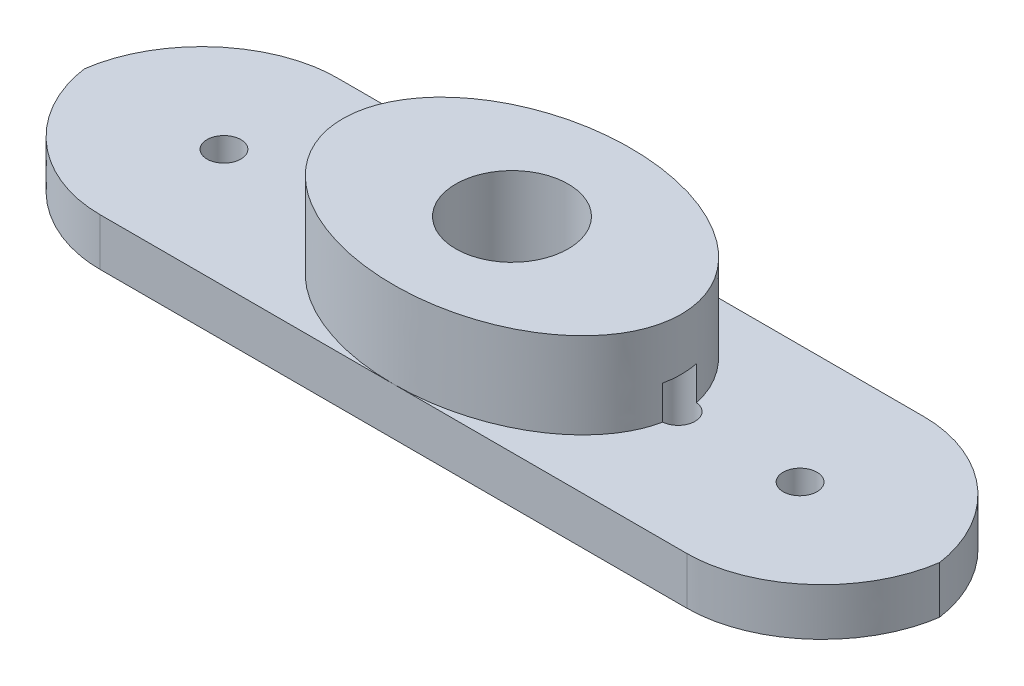
ISO-10303-21;
HEADER;
FILE_DESCRIPTION(('STEP AP214'),'2;1');
FILE_NAME('part.step','',(''),(''),'','','');
FILE_SCHEMA(('AUTOMOTIVE_DESIGN { 1 0 10303 214 1 1 1 1 }'));
ENDSEC;
DATA;
#1=APPLICATION_CONTEXT('core data for automotive mechanical design processes');
#2=APPLICATION_PROTOCOL_DEFINITION('international standard','automotive_design',2000,#1);
#3=PRODUCT_CONTEXT('',#1,'mechanical');
#4=PRODUCT('Part','Part','',(#3));
#5=PRODUCT_RELATED_PRODUCT_CATEGORY('part','',(#4));
#6=PRODUCT_DEFINITION_FORMATION('','',#4);
#7=PRODUCT_DEFINITION_CONTEXT('part definition',#1,'design');
#8=PRODUCT_DEFINITION('design','',#6,#7);
#9=PRODUCT_DEFINITION_SHAPE('','',#8);
#10=(LENGTH_UNIT() NAMED_UNIT(*) SI_UNIT(.MILLI.,.METRE.));
#11=(NAMED_UNIT(*) PLANE_ANGLE_UNIT() SI_UNIT($,.RADIAN.));
#12=(NAMED_UNIT(*) SI_UNIT($,.STERADIAN.) SOLID_ANGLE_UNIT());
#13=UNCERTAINTY_MEASURE_WITH_UNIT(LENGTH_MEASURE(1.E-05),#10,'distance_accuracy_value','');
#14=(GEOMETRIC_REPRESENTATION_CONTEXT(3) GLOBAL_UNCERTAINTY_ASSIGNED_CONTEXT((#13)) GLOBAL_UNIT_ASSIGNED_CONTEXT((#10,
#11,#12)) REPRESENTATION_CONTEXT('',''));
#15=CARTESIAN_POINT('',(0.,0.,0.));
#16=DIRECTION('',(0.,0.,1.));
#17=DIRECTION('',(1.,0.,0.));
#18=AXIS2_PLACEMENT_3D('',#15,#16,#17);
#19=CARTESIAN_POINT('',(16.0782,5.,-4.445));
#20=DIRECTION('',(0.,1.,0.));
#21=DIRECTION('',(1.,0.,0.));
#22=AXIS2_PLACEMENT_3D('',#19,#20,#21);
#23=ELLIPSE('',#22,6.35,4.445);
#24=DIRECTION('',(0.,-1.,0.));
#25=VECTOR('',#24,1.);
#26=SURFACE_OF_LINEAR_EXTRUSION('',#23,#25);
#27=CARTESIAN_POINT('',(22.4282,5.,-4.445));
#28=VERTEX_POINT('',#27);
#29=EDGE_CURVE('E189',#28,#28,#23,.T.);
#30=ORIENTED_EDGE('',*,*,#29,.F.);
#31=EDGE_LOOP('',(#30));
#32=FACE_BOUND('',#31,.T.);
#33=DIRECTION('',(0.,-1.,0.));
#34=VECTOR('',#33,1.);
#35=CARTESIAN_POINT('',(22.3635789640379,5.,-5.077527095412));
#36=LINE('',#35,#34);
#37=CARTESIAN_POINT('',(22.3635789640379,1.778,-5.077527095412));
#38=VERTEX_POINT('',#37);
#39=CARTESIAN_POINT('',(22.3635789640379,3.048,-5.077527095412));
#40=VERTEX_POINT('',#39);
#41=EDGE_CURVE('E13',#38,#40,#36,.F.);
#42=ORIENTED_EDGE('',*,*,#41,.F.);
#43=CARTESIAN_POINT('',(16.0782,1.778,-4.445));
#44=DIRECTION('',(0.,1.,0.));
#45=DIRECTION('',(1.,0.,0.));
#46=AXIS2_PLACEMENT_3D('',#43,#44,#45);
#47=ELLIPSE('',#46,6.35,4.445);
#48=CARTESIAN_POINT('',(16.0782,1.778,-8.89));
#49=VERTEX_POINT('',#48);
#50=EDGE_CURVE('E194',#49,#38,#47,.F.);
#51=ORIENTED_EDGE('',*,*,#50,.F.);
#52=CARTESIAN_POINT('',(9.79282073057326,1.778,-5.0775256084426));
#53=VERTEX_POINT('',#52);
#54=EDGE_CURVE('E156',#53,#49,#47,.F.);
#55=ORIENTED_EDGE('',*,*,#54,.F.);
#56=DIRECTION('',(0.,-1.,0.));
#57=VECTOR('',#56,1.);
#58=CARTESIAN_POINT('',(9.79282073057326,5.,-5.0775256084426));
#59=LINE('',#58,#57);
#60=CARTESIAN_POINT('',(9.79282073057326,3.048,-5.0775256084426));
#61=VERTEX_POINT('',#60);
#62=EDGE_CURVE('E149',#61,#53,#59,.T.);
#63=ORIENTED_EDGE('',*,*,#62,.F.);
#64=CARTESIAN_POINT('',(16.0782,3.048,-4.445));
#65=DIRECTION('',(0.,1.,0.));
#66=DIRECTION('',(1.,0.,0.));
#67=AXIS2_PLACEMENT_3D('',#64,#65,#66);
#68=ELLIPSE('',#67,6.35,4.445);
#69=CARTESIAN_POINT('',(9.79284632009448,3.048,-3.81234980592422));
#70=VERTEX_POINT('',#69);
#71=EDGE_CURVE('E138',#61,#70,#68,.T.);
#72=ORIENTED_EDGE('',*,*,#71,.T.);
#73=DIRECTION('',(0.,-1.,0.));
#74=VECTOR('',#73,1.);
#75=CARTESIAN_POINT('',(9.79284632009448,5.,-3.81234980592423));
#76=LINE('',#75,#74);
#77=CARTESIAN_POINT('',(9.79284632009448,1.778,-3.81234980592423));
#78=VERTEX_POINT('',#77);
#79=EDGE_CURVE('E143',#78,#70,#76,.F.);
#80=ORIENTED_EDGE('',*,*,#79,.F.);
#81=CARTESIAN_POINT('',(16.0782,1.778,0.));
#82=VERTEX_POINT('',#81);
#83=EDGE_CURVE('E560',#82,#78,#47,.F.);
#84=ORIENTED_EDGE('',*,*,#83,.F.);
#85=CARTESIAN_POINT('',(22.3635533745992,1.778,-3.81234831965538));
#86=VERTEX_POINT('',#85);
#87=EDGE_CURVE('E193',#86,#82,#47,.F.);
#88=ORIENTED_EDGE('',*,*,#87,.F.);
#89=DIRECTION('',(0.,-1.,0.));
#90=VECTOR('',#89,1.);
#91=CARTESIAN_POINT('',(22.3635533745992,5.,-3.81234831965538));
#92=LINE('',#91,#90);
#93=CARTESIAN_POINT('',(22.3635533745992,3.048,-3.81234831965538));
#94=VERTEX_POINT('',#93);
#95=EDGE_CURVE('E65',#94,#86,#92,.T.);
#96=ORIENTED_EDGE('',*,*,#95,.F.);
#97=CARTESIAN_POINT('',(16.0782,3.048,-4.445));
#98=DIRECTION('',(0.,1.,0.));
#99=DIRECTION('',(1.,0.,0.));
#100=AXIS2_PLACEMENT_3D('',#97,#98,#99);
#101=ELLIPSE('',#100,6.35,4.445);
#102=EDGE_CURVE('E157',#40,#94,#101,.F.);
#103=ORIENTED_EDGE('',*,*,#102,.F.);
#104=EDGE_LOOP('',(#42,#51,#55,#63,#72,#80,#84,#88,#96,#103));
#105=FACE_BOUND('',#104,.T.);
#106=ADVANCED_FACE('F52',(#32,#105),#26,.F.);
#107=CARTESIAN_POINT('',(0.,1.778,0.));
#108=DIRECTION('',(0.,1.,0.));
#109=DIRECTION('',(0.,0.,1.));
#110=AXIS2_PLACEMENT_3D('',#107,#108,#109);
#111=PLANE('',#110);
#112=CARTESIAN_POINT('',(5.27612861567233,1.778,-4.44493882558521));
#113=DIRECTION('',(0.,1.,0.));
#114=DIRECTION('',(0.,0.,1.));
#115=AXIS2_PLACEMENT_3D('',#112,#113,#114);
#116=CIRCLE('',#115,0.635);
#117=CARTESIAN_POINT('',(5.27612861567233,1.778,-3.80993882558521));
#118=VERTEX_POINT('',#117);
#119=EDGE_CURVE('E164',#118,#118,#116,.F.);
#120=ORIENTED_EDGE('',*,*,#119,.T.);
#121=EDGE_LOOP('',(#120));
#122=FACE_BOUND('',#121,.T.);
#123=ORIENTED_EDGE('',*,*,#83,.T.);
#124=CARTESIAN_POINT('',(9.84812861567233,1.778,-4.44493882558521));
#125=DIRECTION('',(0.,1.,0.));
#126=DIRECTION('',(0.,0.,1.));
#127=AXIS2_PLACEMENT_3D('',#124,#125,#126);
#128=CIRCLE('',#127,0.635);
#129=EDGE_CURVE('E151',#78,#53,#128,.F.);
#130=ORIENTED_EDGE('',*,*,#129,.T.);
#131=ORIENTED_EDGE('',*,*,#54,.T.);
#132=DIRECTION('',(1.,0.,0.));
#133=VECTOR('',#132,1.);
#134=CARTESIAN_POINT('',(0.,1.778,-8.89));
#135=LINE('',#134,#133);
#136=CARTESIAN_POINT('',(5.08,1.778,-8.89));
#137=VERTEX_POINT('',#136);
#138=EDGE_CURVE('E474',#137,#49,#135,.T.);
#139=ORIENTED_EDGE('',*,*,#138,.F.);
#140=CARTESIAN_POINT('',(0.,1.778,-3.81));
#141=CARTESIAN_POINT('',(0.,1.778,-8.88999999999999));
#142=CARTESIAN_POINT('',(5.08,1.778,-8.89));
#143=(BOUNDED_CURVE() B_SPLINE_CURVE(2,(#140,#141,#142),.UNSPECIFIED.,.F.,
.F.) B_SPLINE_CURVE_WITH_KNOTS((3,3),(0.,1.),
.UNSPECIFIED.) CURVE() GEOMETRIC_REPRESENTATION_ITEM() RATIONAL_B_SPLINE_CURVE((1.,
0.666666666666667,1.)) REPRESENTATION_ITEM(''));
#144=CARTESIAN_POINT('',(0.0437286156723288,1.778,-4.44493882558521));
#145=VERTEX_POINT('',#144);
#146=EDGE_CURVE('E554',#137,#145,#143,.F.);
#147=ORIENTED_EDGE('',*,*,#146,.T.);
#148=CARTESIAN_POINT('',(5.08,1.778,0.));
#149=CARTESIAN_POINT('',(0.,1.778,0.));
#150=CARTESIAN_POINT('',(0.,1.778,-5.08));
#151=(BOUNDED_CURVE() B_SPLINE_CURVE(2,(#148,#149,#150),.UNSPECIFIED.,.F.,
.F.) B_SPLINE_CURVE_WITH_KNOTS((3,3),(0.,1.),
.UNSPECIFIED.) CURVE() GEOMETRIC_REPRESENTATION_ITEM() RATIONAL_B_SPLINE_CURVE((1.,
0.666666666666667,1.)) REPRESENTATION_ITEM(''));
#152=CARTESIAN_POINT('',(5.08,1.778,0.));
#153=VERTEX_POINT('',#152);
#154=EDGE_CURVE('E463',#145,#153,#151,.F.);
#155=ORIENTED_EDGE('',*,*,#154,.T.);
#156=DIRECTION('',(1.,0.,0.));
#157=VECTOR('',#156,1.);
#158=CARTESIAN_POINT('',(0.,1.778,0.));
#159=LINE('',#158,#157);
#160=EDGE_CURVE('E545',#153,#82,#159,.T.);
#161=ORIENTED_EDGE('',*,*,#160,.T.);
#162=EDGE_LOOP('',(#123,#130,#131,#139,#147,#155,#161));
#163=FACE_BOUND('',#162,.T.);
#164=ADVANCED_FACE('F200',(#122,#163),#111,.T.);
#165=CARTESIAN_POINT('',(0.,1.778,-8.89));
#166=DIRECTION('',(0.,0.,-1.));
#167=DIRECTION('',(-1.,0.,0.));
#168=AXIS2_PLACEMENT_3D('',#165,#166,#167);
#169=PLANE('',#168);
#170=CARTESIAN_POINT('',(27.0764,-0.0889,-8.89));
#171=CARTESIAN_POINT('',(27.0764,0.563033333333333,-8.89));
#172=CARTESIAN_POINT('',(27.0764,1.21496666666667,-8.89));
#173=CARTESIAN_POINT('',(27.0764,1.8669,-8.89));
#174=(BOUNDED_CURVE() B_SPLINE_CURVE(3,(#170,#171,#172,#173),.UNSPECIFIED.,.F.,
.F.) B_SPLINE_CURVE_WITH_KNOTS((4,4),(-0.0018669,8.89E-05),
.UNSPECIFIED.) CURVE() GEOMETRIC_REPRESENTATION_ITEM() RATIONAL_B_SPLINE_CURVE((1.,1.,1.,1.)) REPRESENTATION_ITEM(''));
#175=CARTESIAN_POINT('',(27.0764,1.778,-8.89));
#176=VERTEX_POINT('',#175);
#177=CARTESIAN_POINT('',(27.0764,0.,-8.89));
#178=VERTEX_POINT('',#177);
#179=EDGE_CURVE('E501',#176,#178,#174,.F.);
#180=ORIENTED_EDGE('',*,*,#179,.T.);
#181=DIRECTION('',(1.,0.,0.));
#182=VECTOR('',#181,1.);
#183=CARTESIAN_POINT('',(0.,0.,-8.89));
#184=LINE('',#183,#182);
#185=CARTESIAN_POINT('',(5.08,0.,-8.89));
#186=VERTEX_POINT('',#185);
#187=EDGE_CURVE('E486',#186,#178,#184,.T.);
#188=ORIENTED_EDGE('',*,*,#187,.F.);
#189=CARTESIAN_POINT('',(5.08,1.8669,-8.89));
#190=CARTESIAN_POINT('',(5.08,1.21496666666667,-8.89));
#191=CARTESIAN_POINT('',(5.08,0.563033333333333,-8.89));
#192=CARTESIAN_POINT('',(5.08,-0.0889000000000003,-8.89));
#193=(BOUNDED_CURVE() B_SPLINE_CURVE(3,(#189,#190,#191,#192),.UNSPECIFIED.,.F.,
.F.) B_SPLINE_CURVE_WITH_KNOTS((4,4),(-8.89E-05,0.0018669),
.UNSPECIFIED.) CURVE() GEOMETRIC_REPRESENTATION_ITEM() RATIONAL_B_SPLINE_CURVE((1.,1.,1.,1.)) REPRESENTATION_ITEM(''));
#194=EDGE_CURVE('E430',#186,#137,#193,.F.);
#195=ORIENTED_EDGE('',*,*,#194,.T.);
#196=ORIENTED_EDGE('',*,*,#138,.T.);
#197=EDGE_CURVE('E467',#49,#176,#135,.T.);
#198=ORIENTED_EDGE('',*,*,#197,.T.);
#199=EDGE_LOOP('',(#180,#188,#195,#196,#198));
#200=FACE_BOUND('',#199,.T.);
#201=ADVANCED_FACE('F268',(#200),#169,.T.);
#202=CARTESIAN_POINT('',(0.,1.778,0.));
#203=DIRECTION('',(0.,0.,-1.));
#204=DIRECTION('',(-1.,0.,0.));
#205=AXIS2_PLACEMENT_3D('',#202,#203,#204);
#206=PLANE('',#205);
#207=CARTESIAN_POINT('',(27.0764,1.778,0.));
#208=VERTEX_POINT('',#207);
#209=EDGE_CURVE('E476',#82,#208,#159,.T.);
#210=ORIENTED_EDGE('',*,*,#209,.F.);
#211=ORIENTED_EDGE('',*,*,#160,.F.);
#212=CARTESIAN_POINT('',(5.08,-0.0889,0.));
#213=CARTESIAN_POINT('',(5.08,0.563033333333333,0.));
#214=CARTESIAN_POINT('',(5.08,1.21496666666667,0.));
#215=CARTESIAN_POINT('',(5.08,1.8669,0.));
#216=(BOUNDED_CURVE() B_SPLINE_CURVE(3,(#212,#213,#214,#215),.UNSPECIFIED.,.F.,
.F.) B_SPLINE_CURVE_WITH_KNOTS((4,4),(-0.0018669,8.89E-05),
.UNSPECIFIED.) CURVE() GEOMETRIC_REPRESENTATION_ITEM() RATIONAL_B_SPLINE_CURVE((1.,1.,1.,1.)) REPRESENTATION_ITEM(''));
#217=CARTESIAN_POINT('',(5.08,0.,0.));
#218=VERTEX_POINT('',#217);
#219=EDGE_CURVE('E253',#153,#218,#216,.F.);
#220=ORIENTED_EDGE('',*,*,#219,.T.);
#221=DIRECTION('',(1.,0.,0.));
#222=VECTOR('',#221,1.);
#223=CARTESIAN_POINT('',(0.,0.,0.));
#224=LINE('',#223,#222);
#225=CARTESIAN_POINT('',(27.0764,0.,0.));
#226=VERTEX_POINT('',#225);
#227=EDGE_CURVE('E475',#218,#226,#224,.T.);
#228=ORIENTED_EDGE('',*,*,#227,.T.);
#229=CARTESIAN_POINT('',(27.0764,1.8669,0.));
#230=CARTESIAN_POINT('',(27.0764,1.21496666666667,0.));
#231=CARTESIAN_POINT('',(27.0764,0.563033333333333,0.));
#232=CARTESIAN_POINT('',(27.0764,-0.0889000000000003,0.));
#233=(BOUNDED_CURVE() B_SPLINE_CURVE(3,(#229,#230,#231,#232),.UNSPECIFIED.,.F.,
.F.) B_SPLINE_CURVE_WITH_KNOTS((4,4),(-8.89E-05,0.0018669),
.UNSPECIFIED.) CURVE() GEOMETRIC_REPRESENTATION_ITEM() RATIONAL_B_SPLINE_CURVE((1.,1.,1.,1.)) REPRESENTATION_ITEM(''));
#234=EDGE_CURVE('E144',#226,#208,#233,.F.);
#235=ORIENTED_EDGE('',*,*,#234,.T.);
#236=EDGE_LOOP('',(#210,#211,#220,#228,#235));
#237=FACE_BOUND('',#236,.T.);
#238=ADVANCED_FACE('F209',(#237),#206,.F.);
#239=CARTESIAN_POINT('',(26.8802880888636,1.778,-4.44493882558521));
#240=DIRECTION('',(0.,1.,0.));
#241=DIRECTION('',(0.,0.,1.));
#242=AXIS2_PLACEMENT_3D('',#239,#240,#241);
#243=CIRCLE('',#242,0.634999999999999);
#244=CARTESIAN_POINT('',(26.8802880888636,1.778,-3.80993882558521));
#245=VERTEX_POINT('',#244);
#246=EDGE_CURVE('E180',#245,#245,#243,.F.);
#247=ORIENTED_EDGE('',*,*,#246,.T.);
#248=EDGE_LOOP('',(#247));
#249=FACE_BOUND('',#248,.T.);
#250=ORIENTED_EDGE('',*,*,#50,.T.);
#251=CARTESIAN_POINT('',(22.3082880888636,1.778,-4.44493882558521));
#252=DIRECTION('',(0.,1.,0.));
#253=DIRECTION('',(0.,0.,1.));
#254=AXIS2_PLACEMENT_3D('',#251,#252,#253);
#255=CIRCLE('',#254,0.634999999999999);
#256=EDGE_CURVE('E171',#38,#86,#255,.F.);
#257=ORIENTED_EDGE('',*,*,#256,.T.);
#258=ORIENTED_EDGE('',*,*,#87,.T.);
#259=ORIENTED_EDGE('',*,*,#209,.T.);
#260=CARTESIAN_POINT('',(32.1564,1.778,-5.08));
#261=CARTESIAN_POINT('',(32.1564,1.778,0.));
#262=CARTESIAN_POINT('',(27.0764,1.778,0.));
#263=(BOUNDED_CURVE() B_SPLINE_CURVE(2,(#260,#261,#262),.UNSPECIFIED.,.F.,
.F.) B_SPLINE_CURVE_WITH_KNOTS((3,3),(0.,1.),
.UNSPECIFIED.) CURVE() GEOMETRIC_REPRESENTATION_ITEM() RATIONAL_B_SPLINE_CURVE((1.,
0.666666666666667,1.)) REPRESENTATION_ITEM(''));
#264=CARTESIAN_POINT('',(32.1126880888636,1.778,-4.44493657044004));
#265=VERTEX_POINT('',#264);
#266=EDGE_CURVE('E354',#208,#265,#263,.F.);
#267=ORIENTED_EDGE('',*,*,#266,.T.);
#268=CARTESIAN_POINT('',(27.0764,1.778,-8.89));
#269=CARTESIAN_POINT('',(32.1564,1.778,-8.89));
#270=CARTESIAN_POINT('',(32.1564,1.778,-3.81));
#271=(BOUNDED_CURVE() B_SPLINE_CURVE(2,(#268,#269,#270),.UNSPECIFIED.,.F.,
.F.) B_SPLINE_CURVE_WITH_KNOTS((3,3),(0.,1.),
.UNSPECIFIED.) CURVE() GEOMETRIC_REPRESENTATION_ITEM() RATIONAL_B_SPLINE_CURVE((1.,
0.666666666666667,1.)) REPRESENTATION_ITEM(''));
#272=EDGE_CURVE('E239',#265,#176,#271,.F.);
#273=ORIENTED_EDGE('',*,*,#272,.T.);
#274=ORIENTED_EDGE('',*,*,#197,.F.);
#275=EDGE_LOOP('',(#250,#257,#258,#259,#267,#273,#274));
#276=FACE_BOUND('',#275,.T.);
#277=ADVANCED_FACE('F204',(#249,#276),#111,.T.);
#278=CARTESIAN_POINT('',(0.,0.,0.));
#279=DIRECTION('',(0.,1.,0.));
#280=DIRECTION('',(0.,0.,1.));
#281=AXIS2_PLACEMENT_3D('',#278,#279,#280);
#282=PLANE('',#281);
#283=CARTESIAN_POINT('',(26.8802880888636,0.,-4.44493882558521));
#284=DIRECTION('',(0.,1.,0.));
#285=DIRECTION('',(0.,0.,1.));
#286=AXIS2_PLACEMENT_3D('',#283,#284,#285);
#287=CIRCLE('',#286,0.634999999999999);
#288=CARTESIAN_POINT('',(26.8802880888636,0.,-3.80993882558521));
#289=VERTEX_POINT('',#288);
#290=EDGE_CURVE('E60',#289,#289,#287,.F.);
#291=ORIENTED_EDGE('',*,*,#290,.F.);
#292=EDGE_LOOP('',(#291));
#293=FACE_BOUND('',#292,.T.);
#294=CARTESIAN_POINT('',(22.3082880888636,0.,-4.44493882558521));
#295=DIRECTION('',(0.,1.,0.));
#296=DIRECTION('',(0.,0.,1.));
#297=AXIS2_PLACEMENT_3D('',#294,#295,#296);
#298=CIRCLE('',#297,0.634999999999999);
#299=CARTESIAN_POINT('',(22.3082880888636,0.,-3.80993882558521));
#300=VERTEX_POINT('',#299);
#301=EDGE_CURVE('E165',#300,#300,#298,.F.);
#302=ORIENTED_EDGE('',*,*,#301,.F.);
#303=EDGE_LOOP('',(#302));
#304=FACE_BOUND('',#303,.T.);
#305=CARTESIAN_POINT('',(5.27612861567233,0.,-4.44493882558521));
#306=DIRECTION('',(0.,1.,0.));
#307=DIRECTION('',(0.,0.,1.));
#308=AXIS2_PLACEMENT_3D('',#305,#306,#307);
#309=CIRCLE('',#308,0.635);
#310=CARTESIAN_POINT('',(5.27612861567233,0.,-3.80993882558521));
#311=VERTEX_POINT('',#310);
#312=EDGE_CURVE('E162',#311,#311,#309,.F.);
#313=ORIENTED_EDGE('',*,*,#312,.F.);
#314=EDGE_LOOP('',(#313));
#315=FACE_BOUND('',#314,.T.);
#316=CARTESIAN_POINT('',(9.84812861567233,0.,-4.44493882558521));
#317=DIRECTION('',(0.,1.,0.));
#318=DIRECTION('',(0.,0.,1.));
#319=AXIS2_PLACEMENT_3D('',#316,#317,#318);
#320=CIRCLE('',#319,0.635);
#321=CARTESIAN_POINT('',(9.84812861567233,0.,-3.80993882558521));
#322=VERTEX_POINT('',#321);
#323=EDGE_CURVE('E176',#322,#322,#320,.F.);
#324=ORIENTED_EDGE('',*,*,#323,.F.);
#325=EDGE_LOOP('',(#324));
#326=FACE_BOUND('',#325,.T.);
#327=CARTESIAN_POINT('',(16.0782,0.,-4.445));
#328=DIRECTION('',(0.,1.,0.));
#329=DIRECTION('',(0.,0.,1.));
#330=AXIS2_PLACEMENT_3D('',#327,#328,#329);
#331=CIRCLE('',#330,2.1082);
#332=CARTESIAN_POINT('',(16.0782,0.,-2.3368));
#333=VERTEX_POINT('',#332);
#334=EDGE_CURVE('E186',#333,#333,#331,.T.);
#335=ORIENTED_EDGE('',*,*,#334,.T.);
#336=EDGE_LOOP('',(#335));
#337=FACE_BOUND('',#336,.T.);
#338=CARTESIAN_POINT('',(27.0764,0.,0.));
#339=CARTESIAN_POINT('',(32.1564,0.,0.));
#340=CARTESIAN_POINT('',(32.1564,0.,-5.08));
#341=(BOUNDED_CURVE() B_SPLINE_CURVE(2,(#338,#339,#340),.UNSPECIFIED.,.F.,
.F.) B_SPLINE_CURVE_WITH_KNOTS((3,3),(0.,1.),
.UNSPECIFIED.) CURVE() GEOMETRIC_REPRESENTATION_ITEM() RATIONAL_B_SPLINE_CURVE((1.,
0.666666666666667,1.)) REPRESENTATION_ITEM(''));
#342=CARTESIAN_POINT('',(32.1126713843277,0.,-4.44493882558523));
#343=VERTEX_POINT('',#342);
#344=EDGE_CURVE('E374',#343,#226,#341,.F.);
#345=ORIENTED_EDGE('',*,*,#344,.T.);
#346=ORIENTED_EDGE('',*,*,#227,.F.);
#347=CARTESIAN_POINT('',(0.,0.,-5.08));
#348=CARTESIAN_POINT('',(0.,0.,0.));
#349=CARTESIAN_POINT('',(5.08,0.,0.));
#350=(BOUNDED_CURVE() B_SPLINE_CURVE(2,(#347,#348,#349),.UNSPECIFIED.,.F.,
.F.) B_SPLINE_CURVE_WITH_KNOTS((3,3),(0.,1.),
.UNSPECIFIED.) CURVE() GEOMETRIC_REPRESENTATION_ITEM() RATIONAL_B_SPLINE_CURVE((1.,
0.666666666666666,1.)) REPRESENTATION_ITEM(''));
#351=CARTESIAN_POINT('',(0.0437119111355024,0.,-4.4449365704399));
#352=VERTEX_POINT('',#351);
#353=EDGE_CURVE('E443',#218,#352,#350,.F.);
#354=ORIENTED_EDGE('',*,*,#353,.T.);
#355=CARTESIAN_POINT('',(5.08,0.,-8.89));
#356=CARTESIAN_POINT('',(0.,0.,-8.88999999999999));
#357=CARTESIAN_POINT('',(0.,0.,-3.80999999999999));
#358=(BOUNDED_CURVE() B_SPLINE_CURVE(2,(#355,#356,#357),.UNSPECIFIED.,.F.,
.F.) B_SPLINE_CURVE_WITH_KNOTS((3,3),(0.,1.),
.UNSPECIFIED.) CURVE() GEOMETRIC_REPRESENTATION_ITEM() RATIONAL_B_SPLINE_CURVE((1.,
0.666666666666667,1.)) REPRESENTATION_ITEM(''));
#359=EDGE_CURVE('E388',#352,#186,#358,.F.);
#360=ORIENTED_EDGE('',*,*,#359,.T.);
#361=ORIENTED_EDGE('',*,*,#187,.T.);
#362=CARTESIAN_POINT('',(32.1564,0.,-3.81));
#363=CARTESIAN_POINT('',(32.1564,0.,-8.89));
#364=CARTESIAN_POINT('',(27.0764,0.,-8.89));
#365=(BOUNDED_CURVE() B_SPLINE_CURVE(2,(#362,#363,#364),.UNSPECIFIED.,.F.,
.F.) B_SPLINE_CURVE_WITH_KNOTS((3,3),(0.,1.),
.UNSPECIFIED.) CURVE() GEOMETRIC_REPRESENTATION_ITEM() RATIONAL_B_SPLINE_CURVE((1.,
0.666666666666666,1.)) REPRESENTATION_ITEM(''));
#366=EDGE_CURVE('E284',#178,#343,#365,.F.);
#367=ORIENTED_EDGE('',*,*,#366,.T.);
#368=EDGE_LOOP('',(#345,#346,#354,#360,#361,#367));
#369=FACE_BOUND('',#368,.T.);
#370=ADVANCED_FACE('F208',(#293,#304,#315,#326,#337,#369),#282,.F.);
#371=CARTESIAN_POINT('',(32.1564,1.8669,-5.08));
#372=CARTESIAN_POINT('',(32.1564,1.21496666666667,-5.08));
#373=CARTESIAN_POINT('',(32.1564,0.563033333333333,-5.08));
#374=CARTESIAN_POINT('',(32.1564,-0.0889000000000003,-5.08));
#375=CARTESIAN_POINT('',(32.1564,1.8669,0.));
#376=CARTESIAN_POINT('',(32.1564,1.21496666666667,0.));
#377=CARTESIAN_POINT('',(32.1564,0.563033333333333,0.));
#378=CARTESIAN_POINT('',(32.1564,-0.0889000000000003,0.));
#379=CARTESIAN_POINT('',(27.0764,1.8669,0.));
#380=CARTESIAN_POINT('',(27.0764,1.21496666666667,0.));
#381=CARTESIAN_POINT('',(27.0764,0.563033333333333,0.));
#382=CARTESIAN_POINT('',(27.0764,-0.0889000000000003,0.));
#383=(BOUNDED_SURFACE() B_SPLINE_SURFACE(2,3,((#371,#372,#373,#374),(#375,#376,#377,#378),(#379,
#380,#381,#382)),.UNSPECIFIED.,.F.,.F.,.F.) B_SPLINE_SURFACE_WITH_KNOTS((3,3),(4,4),(0.,1.),
(-8.89E-05,0.0018669),
.UNSPECIFIED.) GEOMETRIC_REPRESENTATION_ITEM() RATIONAL_B_SPLINE_SURFACE(((1.,1.,1.,1.),
(0.666666666666667,0.666666666666667,0.666666666666667,0.666666666666667),(1.,1.,1.,1.))) REPRESENTATION_ITEM('') SURFACE());
#384=CARTESIAN_POINT('',(32.1122257140172,1.8669,-4.44500000000003));
#385=CARTESIAN_POINT('',(32.1122257140172,1.21496666666667,-4.44500000000003));
#386=CARTESIAN_POINT('',(32.1122257140172,0.563033333333333,-4.44500000000003));
#387=CARTESIAN_POINT('',(32.1122257140172,-0.0889,-4.44500000000003));
#388=(BOUNDED_CURVE() B_SPLINE_CURVE(3,(#384,#385,#386,#387),.UNSPECIFIED.,.F.,
.F.) B_SPLINE_CURVE_WITH_KNOTS((4,4),(-0.0018669,8.89E-05),
.UNSPECIFIED.) CURVE() GEOMETRIC_REPRESENTATION_ITEM() RATIONAL_B_SPLINE_CURVE((0.945043689691025,
0.945043689691025,0.945043689691025,0.945043689691025)) REPRESENTATION_ITEM(''));
#389=EDGE_CURVE('E331',#265,#343,#388,.T.);
#390=ORIENTED_EDGE('',*,*,#389,.F.);
#391=ORIENTED_EDGE('',*,*,#266,.F.);
#392=ORIENTED_EDGE('',*,*,#234,.F.);
#393=ORIENTED_EDGE('',*,*,#344,.F.);
#394=EDGE_LOOP('',(#390,#391,#392,#393));
#395=FACE_BOUND('',#394,.T.);
#396=ADVANCED_FACE('F305',(#395),#383,.T.);
#397=CARTESIAN_POINT('',(32.1564,-0.0889,-3.81));
#398=CARTESIAN_POINT('',(32.1564,0.563033333333333,-3.81));
#399=CARTESIAN_POINT('',(32.1564,1.21496666666667,-3.81));
#400=CARTESIAN_POINT('',(32.1564,1.8669,-3.81));
#401=CARTESIAN_POINT('',(32.1564,-0.0889,-8.89));
#402=CARTESIAN_POINT('',(32.1564,0.563033333333333,-8.89));
#403=CARTESIAN_POINT('',(32.1564,1.21496666666667,-8.89));
#404=CARTESIAN_POINT('',(32.1564,1.8669,-8.89));
#405=CARTESIAN_POINT('',(27.0764,-0.0889,-8.89));
#406=CARTESIAN_POINT('',(27.0764,0.563033333333333,-8.89));
#407=CARTESIAN_POINT('',(27.0764,1.21496666666667,-8.89));
#408=CARTESIAN_POINT('',(27.0764,1.8669,-8.89));
#409=(BOUNDED_SURFACE() B_SPLINE_SURFACE(2,3,((#397,#398,#399,#400),(#401,#402,#403,#404),(#405,
#406,#407,#408)),.UNSPECIFIED.,.F.,.F.,.F.) B_SPLINE_SURFACE_WITH_KNOTS((3,3),(4,4),(0.,1.),
(-0.0018669,8.89E-05),
.UNSPECIFIED.) GEOMETRIC_REPRESENTATION_ITEM() RATIONAL_B_SPLINE_SURFACE(((1.,1.,1.,1.),
(0.666666666666667,0.666666666666667,0.666666666666667,0.666666666666667),(1.,1.,1.,1.))) REPRESENTATION_ITEM('') SURFACE());
#410=ORIENTED_EDGE('',*,*,#272,.F.);
#411=ORIENTED_EDGE('',*,*,#389,.T.);
#412=ORIENTED_EDGE('',*,*,#366,.F.);
#413=ORIENTED_EDGE('',*,*,#179,.F.);
#414=EDGE_LOOP('',(#410,#411,#412,#413));
#415=FACE_BOUND('',#414,.T.);
#416=ADVANCED_FACE('F291',(#415),#409,.T.);
#417=CARTESIAN_POINT('',(0.,-0.0889,-5.08));
#418=CARTESIAN_POINT('',(0.,0.563033333333333,-5.08));
#419=CARTESIAN_POINT('',(0.,1.21496666666667,-5.08));
#420=CARTESIAN_POINT('',(0.,1.8669,-5.08));
#421=CARTESIAN_POINT('',(0.,-0.0889,0.));
#422=CARTESIAN_POINT('',(0.,0.563033333333333,0.));
#423=CARTESIAN_POINT('',(0.,1.21496666666667,0.));
#424=CARTESIAN_POINT('',(0.,1.8669,0.));
#425=CARTESIAN_POINT('',(5.08,-0.0889,0.));
#426=CARTESIAN_POINT('',(5.08,0.563033333333333,0.));
#427=CARTESIAN_POINT('',(5.08,1.21496666666667,0.));
#428=CARTESIAN_POINT('',(5.08,1.8669,0.));
#429=(BOUNDED_SURFACE() B_SPLINE_SURFACE(2,3,((#417,#418,#419,#420),(#421,#422,#423,#424),(#425,
#426,#427,#428)),.UNSPECIFIED.,.F.,.F.,.F.) B_SPLINE_SURFACE_WITH_KNOTS((3,3),(4,4),(0.,1.),
(-0.0018669,8.89E-05),
.UNSPECIFIED.) GEOMETRIC_REPRESENTATION_ITEM() RATIONAL_B_SPLINE_SURFACE(((1.,1.,1.,1.),
(0.666666666666667,0.666666666666667,0.666666666666667,0.666666666666667),(1.,1.,1.,1.))) REPRESENTATION_ITEM('') SURFACE());
#430=CARTESIAN_POINT('',(0.0441742859827841,-0.0889000000000003,-4.445));
#431=CARTESIAN_POINT('',(0.0441742859827841,0.563033333333333,-4.445));
#432=CARTESIAN_POINT('',(0.0441742859827841,1.21496666666667,-4.445));
#433=CARTESIAN_POINT('',(0.0441742859827841,1.8669,-4.445));
#434=(BOUNDED_CURVE() B_SPLINE_CURVE(3,(#430,#431,#432,#433),.UNSPECIFIED.,.F.,
.F.) B_SPLINE_CURVE_WITH_KNOTS((4,4),(-8.89E-05,0.0018669),
.UNSPECIFIED.) CURVE() GEOMETRIC_REPRESENTATION_ITEM() RATIONAL_B_SPLINE_CURVE((0.945043689691027,
0.945043689691027,0.945043689691027,0.945043689691027)) REPRESENTATION_ITEM(''));
#435=EDGE_CURVE('E561',#352,#145,#434,.T.);
#436=ORIENTED_EDGE('',*,*,#219,.F.);
#437=ORIENTED_EDGE('',*,*,#154,.F.);
#438=ORIENTED_EDGE('',*,*,#435,.F.);
#439=ORIENTED_EDGE('',*,*,#353,.F.);
#440=EDGE_LOOP('',(#436,#437,#438,#439));
#441=FACE_BOUND('',#440,.T.);
#442=ADVANCED_FACE('F55',(#441),#429,.T.);
#443=CARTESIAN_POINT('',(0.,1.8669,-3.81));
#444=CARTESIAN_POINT('',(0.,1.21496666666667,-3.81));
#445=CARTESIAN_POINT('',(0.,0.563033333333333,-3.81));
#446=CARTESIAN_POINT('',(0.,-0.0889000000000003,-3.81));
#447=CARTESIAN_POINT('',(0.,1.8669,-8.88999999999999));
#448=CARTESIAN_POINT('',(0.,1.21496666666667,-8.88999999999999));
#449=CARTESIAN_POINT('',(0.,0.563033333333333,-8.88999999999999));
#450=CARTESIAN_POINT('',(0.,-0.0889000000000003,-8.88999999999999));
#451=CARTESIAN_POINT('',(5.08,1.8669,-8.89));
#452=CARTESIAN_POINT('',(5.08,1.21496666666667,-8.89));
#453=CARTESIAN_POINT('',(5.08,0.563033333333333,-8.89));
#454=CARTESIAN_POINT('',(5.08,-0.0889000000000003,-8.89));
#455=(BOUNDED_SURFACE() B_SPLINE_SURFACE(2,3,((#443,#444,#445,#446),(#447,#448,#449,#450),(#451,
#452,#453,#454)),.UNSPECIFIED.,.F.,.F.,.F.) B_SPLINE_SURFACE_WITH_KNOTS((3,3),(4,4),(0.,1.),
(-8.89E-05,0.0018669),
.UNSPECIFIED.) GEOMETRIC_REPRESENTATION_ITEM() RATIONAL_B_SPLINE_SURFACE(((1.,1.,1.,1.),
(0.666666666666667,0.666666666666667,0.666666666666667,0.666666666666667),(1.,1.,1.,1.))) REPRESENTATION_ITEM('') SURFACE());
#456=ORIENTED_EDGE('',*,*,#146,.F.);
#457=ORIENTED_EDGE('',*,*,#194,.F.);
#458=ORIENTED_EDGE('',*,*,#359,.F.);
#459=ORIENTED_EDGE('',*,*,#435,.T.);
#460=EDGE_LOOP('',(#456,#457,#458,#459));
#461=FACE_BOUND('',#460,.T.);
#462=ADVANCED_FACE('F394',(#461),#455,.T.);
#463=CARTESIAN_POINT('',(16.0782,5.,-4.445));
#464=DIRECTION('',(0.,1.,0.));
#465=DIRECTION('',(0.,0.,1.));
#466=AXIS2_PLACEMENT_3D('',#463,#464,#465);
#467=PLANE('',#466);
#468=CARTESIAN_POINT('',(16.0782,5.,-4.445));
#469=DIRECTION('',(0.,1.,0.));
#470=DIRECTION('',(0.,0.,1.));
#471=AXIS2_PLACEMENT_3D('',#468,#469,#470);
#472=CIRCLE('',#471,2.1082);
#473=CARTESIAN_POINT('',(16.0782,5.,-2.3368));
#474=VERTEX_POINT('',#473);
#475=EDGE_CURVE('E183',#474,#474,#472,.T.);
#476=ORIENTED_EDGE('',*,*,#475,.F.);
#477=EDGE_LOOP('',(#476));
#478=FACE_BOUND('',#477,.T.);
#479=ORIENTED_EDGE('',*,*,#29,.T.);
#480=EDGE_LOOP('',(#479));
#481=FACE_BOUND('',#480,.T.);
#482=ADVANCED_FACE('F202',(#478,#481),#467,.T.);
#483=CARTESIAN_POINT('',(16.0782,-0.0277335261847904,-4.445));
#484=DIRECTION('',(0.,1.,0.));
#485=DIRECTION('',(0.,0.,1.));
#486=AXIS2_PLACEMENT_3D('',#483,#484,#485);
#487=CYLINDRICAL_SURFACE('',#486,2.1082);
#488=ORIENTED_EDGE('',*,*,#475,.T.);
#489=EDGE_LOOP('',(#488));
#490=FACE_BOUND('',#489,.T.);
#491=ORIENTED_EDGE('',*,*,#334,.F.);
#492=EDGE_LOOP('',(#491));
#493=FACE_BOUND('',#492,.T.);
#494=ADVANCED_FACE('F575',(#490,#493),#487,.F.);
#495=CARTESIAN_POINT('',(9.84812861567233,3.048,-4.44493882558521));
#496=DIRECTION('',(0.,-1.,0.));
#497=DIRECTION('',(0.,0.,-1.));
#498=AXIS2_PLACEMENT_3D('',#495,#496,#497);
#499=CYLINDRICAL_SURFACE('',#498,0.635);
#500=ORIENTED_EDGE('',*,*,#62,.T.);
#501=ORIENTED_EDGE('',*,*,#129,.F.);
#502=ORIENTED_EDGE('',*,*,#79,.T.);
#503=CARTESIAN_POINT('',(9.84812861567233,3.048,-4.44493882558521));
#504=DIRECTION('',(0.,1.,0.));
#505=DIRECTION('',(0.,0.,1.));
#506=AXIS2_PLACEMENT_3D('',#503,#504,#505);
#507=CIRCLE('',#506,0.635);
#508=EDGE_CURVE('E78',#70,#61,#507,.T.);
#509=ORIENTED_EDGE('',*,*,#508,.T.);
#510=EDGE_LOOP('',(#500,#501,#502,#509));
#511=FACE_BOUND('',#510,.T.);
#512=ORIENTED_EDGE('',*,*,#323,.T.);
#513=EDGE_LOOP('',(#512));
#514=FACE_BOUND('',#513,.T.);
#515=ADVANCED_FACE('F147',(#511,#514),#499,.F.);
#516=CARTESIAN_POINT('',(9.84812861567233,3.048,-4.44493882558521));
#517=DIRECTION('',(0.,1.,0.));
#518=DIRECTION('',(0.,0.,1.));
#519=AXIS2_PLACEMENT_3D('',#516,#517,#518);
#520=PLANE('',#519);
#521=ORIENTED_EDGE('',*,*,#508,.F.);
#522=ORIENTED_EDGE('',*,*,#71,.F.);
#523=EDGE_LOOP('',(#521,#522));
#524=FACE_BOUND('',#523,.T.);
#525=ADVANCED_FACE('F139',(#524),#520,.F.);
#526=CARTESIAN_POINT('',(22.3082880888636,3.048,-4.44493882558521));
#527=DIRECTION('',(0.,-1.,0.));
#528=DIRECTION('',(0.,0.,-1.));
#529=AXIS2_PLACEMENT_3D('',#526,#527,#528);
#530=CYLINDRICAL_SURFACE('',#529,0.634999999999999);
#531=ORIENTED_EDGE('',*,*,#41,.T.);
#532=CARTESIAN_POINT('',(22.3082880888636,3.048,-4.44493882558521));
#533=DIRECTION('',(0.,1.,0.));
#534=DIRECTION('',(0.,0.,-1.));
#535=AXIS2_PLACEMENT_3D('',#532,#533,#534);
#536=CIRCLE('',#535,0.634999999999999);
#537=EDGE_CURVE('E72',#40,#94,#536,.T.);
#538=ORIENTED_EDGE('',*,*,#537,.T.);
#539=ORIENTED_EDGE('',*,*,#95,.T.);
#540=ORIENTED_EDGE('',*,*,#256,.F.);
#541=EDGE_LOOP('',(#531,#538,#539,#540));
#542=FACE_BOUND('',#541,.T.);
#543=ORIENTED_EDGE('',*,*,#301,.T.);
#544=EDGE_LOOP('',(#543));
#545=FACE_BOUND('',#544,.T.);
#546=ADVANCED_FACE('F564',(#542,#545),#530,.F.);
#547=CARTESIAN_POINT('',(22.3082880888636,3.048,-4.44493882558521));
#548=DIRECTION('',(0.,-1.,0.));
#549=DIRECTION('',(0.,0.,-1.));
#550=AXIS2_PLACEMENT_3D('',#547,#548,#549);
#551=PLANE('',#550);
#552=ORIENTED_EDGE('',*,*,#102,.T.);
#553=ORIENTED_EDGE('',*,*,#537,.F.);
#554=EDGE_LOOP('',(#552,#553));
#555=FACE_BOUND('',#554,.T.);
#556=ADVANCED_FACE('F594',(#555),#551,.T.);
#557=CARTESIAN_POINT('',(5.27612861567233,3.048,-4.44493882558521));
#558=DIRECTION('',(0.,-1.,0.));
#559=DIRECTION('',(0.,0.,-1.));
#560=AXIS2_PLACEMENT_3D('',#557,#558,#559);
#561=CYLINDRICAL_SURFACE('',#560,0.635);
#562=ORIENTED_EDGE('',*,*,#119,.F.);
#563=EDGE_LOOP('',(#562));
#564=FACE_BOUND('',#563,.T.);
#565=ORIENTED_EDGE('',*,*,#312,.T.);
#566=EDGE_LOOP('',(#565));
#567=FACE_BOUND('',#566,.T.);
#568=ADVANCED_FACE('F590',(#564,#567),#561,.F.);
#569=CARTESIAN_POINT('',(26.8802880888636,3.048,-4.44493882558521));
#570=DIRECTION('',(0.,-1.,0.));
#571=DIRECTION('',(0.,0.,-1.));
#572=AXIS2_PLACEMENT_3D('',#569,#570,#571);
#573=CYLINDRICAL_SURFACE('',#572,0.634999999999999);
#574=ORIENTED_EDGE('',*,*,#246,.F.);
#575=EDGE_LOOP('',(#574));
#576=FACE_BOUND('',#575,.T.);
#577=ORIENTED_EDGE('',*,*,#290,.T.);
#578=EDGE_LOOP('',(#577));
#579=FACE_BOUND('',#578,.T.);
#580=ADVANCED_FACE('F587',(#576,#579),#573,.F.);
#581=CLOSED_SHELL('',(#106,#164,#201,#238,#277,#370,#396,#416,#442,#462,#482,#494,#515,#525,
#546,#556,#568,#580));
#582=MANIFOLD_SOLID_BREP('B2',#581);
#583=ADVANCED_BREP_SHAPE_REPRESENTATION('',(#18,#582),#14);
#584=SHAPE_DEFINITION_REPRESENTATION(#9,#583);
ENDSEC;
END-ISO-10303-21;
